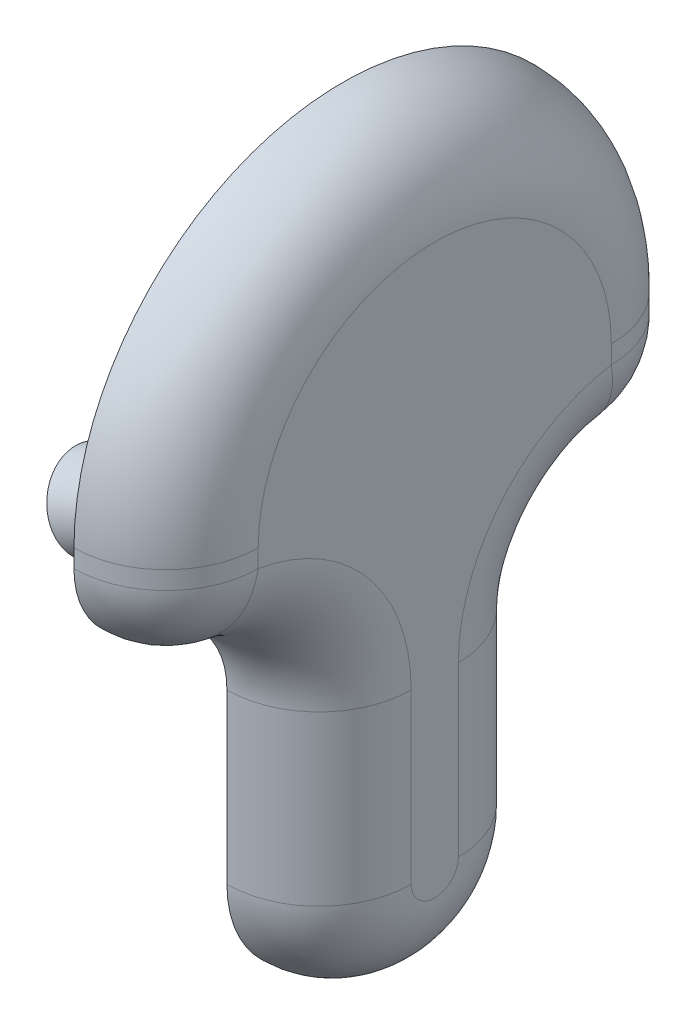
ISO-10303-21;
HEADER;
FILE_DESCRIPTION(('STEP AP214'),'2;1');
FILE_NAME('part.step','',(''),(''),'','','');
FILE_SCHEMA(('AUTOMOTIVE_DESIGN { 1 0 10303 214 1 1 1 1 }'));
ENDSEC;
DATA;
#1=APPLICATION_CONTEXT('core data for automotive mechanical design processes');
#2=APPLICATION_PROTOCOL_DEFINITION('international standard','automotive_design',2000,#1);
#3=PRODUCT_CONTEXT('',#1,'mechanical');
#4=PRODUCT('Part','Part','',(#3));
#5=PRODUCT_RELATED_PRODUCT_CATEGORY('part','',(#4));
#6=PRODUCT_DEFINITION_FORMATION('','',#4);
#7=PRODUCT_DEFINITION_CONTEXT('part definition',#1,'design');
#8=PRODUCT_DEFINITION('design','',#6,#7);
#9=PRODUCT_DEFINITION_SHAPE('','',#8);
#10=(LENGTH_UNIT() NAMED_UNIT(*) SI_UNIT(.MILLI.,.METRE.));
#11=(NAMED_UNIT(*) PLANE_ANGLE_UNIT() SI_UNIT($,.RADIAN.));
#12=(NAMED_UNIT(*) SI_UNIT($,.STERADIAN.) SOLID_ANGLE_UNIT());
#13=UNCERTAINTY_MEASURE_WITH_UNIT(LENGTH_MEASURE(1.E-05),#10,'distance_accuracy_value','');
#14=(GEOMETRIC_REPRESENTATION_CONTEXT(3) GLOBAL_UNCERTAINTY_ASSIGNED_CONTEXT((#13)) GLOBAL_UNIT_ASSIGNED_CONTEXT((#10,
#11,#12)) REPRESENTATION_CONTEXT('',''));
#15=CARTESIAN_POINT('',(0.,0.,0.));
#16=DIRECTION('',(0.,0.,1.));
#17=DIRECTION('',(1.,0.,0.));
#18=AXIS2_PLACEMENT_3D('',#15,#16,#17);
#19=CARTESIAN_POINT('',(0.,0.,57.5));
#20=DIRECTION('',(0.,1.,0.));
#21=DIRECTION('',(0.,0.,1.));
#22=AXIS2_PLACEMENT_3D('',#19,#20,#21);
#23=CYLINDRICAL_SURFACE('',#22,30.);
#24=CARTESIAN_POINT('',(0.,29.1295933013957,57.5));
#25=DIRECTION('',(0.,-1.,0.));
#26=DIRECTION('',(0.,0.,-1.));
#27=AXIS2_PLACEMENT_3D('',#24,#25,#26);
#28=CIRCLE('',#27,30.);
#29=CARTESIAN_POINT('',(30.,29.1295933013957,57.5));
#30=VERTEX_POINT('',#29);
#31=CARTESIAN_POINT('',(0.,29.1295933013957,87.5));
#32=VERTEX_POINT('',#31);
#33=EDGE_CURVE('E11',#30,#32,#28,.T.);
#34=ORIENTED_EDGE('',*,*,#33,.F.);
#35=DIRECTION('',(0.,-1.,0.));
#36=VECTOR('',#35,1.);
#37=CARTESIAN_POINT('',(30.,0.,57.5));
#38=LINE('',#37,#36);
#39=CARTESIAN_POINT('',(30.,35.,57.5));
#40=VERTEX_POINT('',#39);
#41=EDGE_CURVE('E216',#40,#30,#38,.T.);
#42=ORIENTED_EDGE('',*,*,#41,.F.);
#43=CARTESIAN_POINT('',(0.,35.,57.5));
#44=DIRECTION('',(0.,-1.,0.));
#45=DIRECTION('',(0.,0.,-1.));
#46=AXIS2_PLACEMENT_3D('',#43,#44,#45);
#47=CIRCLE('',#46,30.);
#48=CARTESIAN_POINT('',(0.,35.,87.5));
#49=VERTEX_POINT('',#48);
#50=EDGE_CURVE('E53',#40,#49,#47,.T.);
#51=ORIENTED_EDGE('',*,*,#50,.T.);
#52=DIRECTION('',(0.,-1.,0.));
#53=VECTOR('',#52,1.);
#54=CARTESIAN_POINT('',(0.,122.5,87.5));
#55=LINE('',#54,#53);
#56=EDGE_CURVE('E148',#49,#32,#55,.T.);
#57=ORIENTED_EDGE('',*,*,#56,.T.);
#58=EDGE_LOOP('',(#34,#42,#51,#57));
#59=FACE_BOUND('',#58,.T.);
#60=ADVANCED_FACE('F44',(#59),#23,.T.);
#61=CARTESIAN_POINT('',(0.,35.,0.));
#62=DIRECTION('',(1.,0.,0.));
#63=DIRECTION('',(0.,0.,-1.));
#64=AXIS2_PLACEMENT_3D('',#61,#62,#63);
#65=TOROIDAL_SURFACE('',#64,57.5,30.);
#66=ORIENTED_EDGE('',*,*,#50,.F.);
#67=CARTESIAN_POINT('',(30.,35.,0.));
#68=DIRECTION('',(1.,0.,0.));
#69=DIRECTION('',(0.,0.,-1.));
#70=AXIS2_PLACEMENT_3D('',#67,#68,#69);
#71=CIRCLE('',#70,57.5);
#72=CARTESIAN_POINT('',(30.,35.,-57.5));
#73=VERTEX_POINT('',#72);
#74=EDGE_CURVE('E220',#73,#40,#71,.T.);
#75=ORIENTED_EDGE('',*,*,#74,.F.);
#76=CARTESIAN_POINT('',(0.,35.,-57.5));
#77=DIRECTION('',(0.,1.,0.));
#78=DIRECTION('',(0.,0.,1.));
#79=AXIS2_PLACEMENT_3D('',#76,#77,#78);
#80=CIRCLE('',#79,30.);
#81=CARTESIAN_POINT('',(0.,35.,-87.5));
#82=VERTEX_POINT('',#81);
#83=EDGE_CURVE('E60',#73,#82,#80,.T.);
#84=ORIENTED_EDGE('',*,*,#83,.T.);
#85=CARTESIAN_POINT('',(0.,35.,0.));
#86=DIRECTION('',(1.,0.,0.));
#87=DIRECTION('',(0.,0.,-1.));
#88=AXIS2_PLACEMENT_3D('',#85,#86,#87);
#89=CIRCLE('',#88,87.5);
#90=EDGE_CURVE('E168',#49,#82,#89,.F.);
#91=ORIENTED_EDGE('',*,*,#90,.F.);
#92=EDGE_LOOP('',(#66,#75,#84,#91));
#93=FACE_BOUND('',#92,.T.);
#94=ADVANCED_FACE('F237',(#93),#65,.T.);
#95=CARTESIAN_POINT('',(0.,0.,-57.5));
#96=DIRECTION('',(0.,-1.,0.));
#97=DIRECTION('',(0.,0.,-1.));
#98=AXIS2_PLACEMENT_3D('',#95,#96,#97);
#99=CYLINDRICAL_SURFACE('',#98,30.);
#100=ORIENTED_EDGE('',*,*,#83,.F.);
#101=DIRECTION('',(0.,1.,0.));
#102=VECTOR('',#101,1.);
#103=CARTESIAN_POINT('',(30.,0.,-57.5));
#104=LINE('',#103,#102);
#105=CARTESIAN_POINT('',(30.,29.1295933013957,-57.5));
#106=VERTEX_POINT('',#105);
#107=EDGE_CURVE('E223',#106,#73,#104,.T.);
#108=ORIENTED_EDGE('',*,*,#107,.F.);
#109=CARTESIAN_POINT('',(0.,29.1295933013957,-57.5));
#110=DIRECTION('',(0.,1.,0.));
#111=DIRECTION('',(0.,0.,1.));
#112=AXIS2_PLACEMENT_3D('',#109,#110,#111);
#113=CIRCLE('',#112,30.);
#114=CARTESIAN_POINT('',(0.,29.1295933013957,-87.5));
#115=VERTEX_POINT('',#114);
#116=EDGE_CURVE('E229',#106,#115,#113,.T.);
#117=ORIENTED_EDGE('',*,*,#116,.T.);
#118=DIRECTION('',(0.,1.,0.));
#119=VECTOR('',#118,1.);
#120=CARTESIAN_POINT('',(0.,122.5,-87.5));
#121=LINE('',#120,#119);
#122=EDGE_CURVE('E143',#115,#82,#121,.T.);
#123=ORIENTED_EDGE('',*,*,#122,.T.);
#124=EDGE_LOOP('',(#100,#108,#117,#123));
#125=FACE_BOUND('',#124,.T.);
#126=ADVANCED_FACE('F270',(#125),#99,.T.);
#127=CARTESIAN_POINT('',(0.,29.1295933013957,-57.5));
#128=DIRECTION('',(0.,0.,1.));
#129=DIRECTION('',(0.,-1.,0.));
#130=AXIS2_PLACEMENT_3D('',#127,#128,#129);
#131=SPHERICAL_SURFACE('',#130,30.);
#132=ORIENTED_EDGE('',*,*,#116,.F.);
#133=CARTESIAN_POINT('',(0.,29.1295933013957,-57.5));
#134=DIRECTION('',(0.,-0.169714790172235,0.985493221689928));
#135=DIRECTION('',(0.,-0.985493221689928,-0.169714790172235));
#136=AXIS2_PLACEMENT_3D('',#133,#134,#135);
#137=CIRCLE('',#136,30.);
#138=CARTESIAN_POINT('',(0.,-0.435203349302138,-62.5914437051671));
#139=VERTEX_POINT('',#138);
#140=EDGE_CURVE('E205',#139,#106,#137,.T.);
#141=ORIENTED_EDGE('',*,*,#140,.F.);
#142=CARTESIAN_POINT('',(0.,29.1295933013957,-57.5));
#143=DIRECTION('',(1.,0.,0.));
#144=DIRECTION('',(0.,0.,-1.));
#145=AXIS2_PLACEMENT_3D('',#142,#143,#144);
#146=CIRCLE('',#145,30.);
#147=EDGE_CURVE('E213',#115,#139,#146,.F.);
#148=ORIENTED_EDGE('',*,*,#147,.F.);
#149=EDGE_LOOP('',(#132,#141,#148));
#150=FACE_BOUND('',#149,.T.);
#151=ADVANCED_FACE('F269',(#150),#131,.T.);
#152=CARTESIAN_POINT('',(0.,29.1295933013957,57.5));
#153=DIRECTION('',(0.,0.,-1.));
#154=DIRECTION('',(0.,1.,0.));
#155=AXIS2_PLACEMENT_3D('',#152,#153,#154);
#156=SPHERICAL_SURFACE('',#155,30.);
#157=CARTESIAN_POINT('',(0.,29.1295933013957,57.5));
#158=DIRECTION('',(0.,0.169714790172235,0.985493221689928));
#159=DIRECTION('',(0.,-0.985493221689928,0.169714790172235));
#160=AXIS2_PLACEMENT_3D('',#157,#158,#159);
#161=CIRCLE('',#160,30.);
#162=CARTESIAN_POINT('',(0.,-0.435203349302141,62.591443705167));
#163=VERTEX_POINT('',#162);
#164=EDGE_CURVE('E226',#30,#163,#161,.F.);
#165=ORIENTED_EDGE('',*,*,#164,.F.);
#166=ORIENTED_EDGE('',*,*,#33,.T.);
#167=CARTESIAN_POINT('',(0.,29.1295933013957,57.5));
#168=DIRECTION('',(1.,0.,0.));
#169=DIRECTION('',(0.,0.,-1.));
#170=AXIS2_PLACEMENT_3D('',#167,#168,#169);
#171=CIRCLE('',#170,30.);
#172=EDGE_CURVE('E209',#163,#32,#171,.F.);
#173=ORIENTED_EDGE('',*,*,#172,.F.);
#174=EDGE_LOOP('',(#165,#166,#173));
#175=FACE_BOUND('',#174,.T.);
#176=ADVANCED_FACE('F46',(#175),#156,.T.);
#177=CARTESIAN_POINT('',(0.,-30.,-67.6828874103341));
#178=DIRECTION('',(1.,0.,0.));
#179=DIRECTION('',(0.,0.,-1.));
#180=AXIS2_PLACEMENT_3D('',#177,#178,#179);
#181=TOROIDAL_SURFACE('',#180,60.,30.);
#182=CARTESIAN_POINT('',(0.,-30.,-67.6828874103341));
#183=DIRECTION('',(1.,0.,0.));
#184=DIRECTION('',(0.,0.,-1.));
#185=AXIS2_PLACEMENT_3D('',#182,#183,#184);
#186=CIRCLE('',#185,30.);
#187=CARTESIAN_POINT('',(0.,-30.,-37.6828874103342));
#188=VERTEX_POINT('',#187);
#189=EDGE_CURVE('E164',#188,#139,#186,.F.);
#190=ORIENTED_EDGE('',*,*,#189,.T.);
#191=ORIENTED_EDGE('',*,*,#140,.T.);
#192=CARTESIAN_POINT('',(30.,-30.,-67.6828874103341));
#193=DIRECTION('',(1.,0.,0.));
#194=DIRECTION('',(0.,0.,-1.));
#195=AXIS2_PLACEMENT_3D('',#192,#193,#194);
#196=CIRCLE('',#195,60.);
#197=CARTESIAN_POINT('',(30.,-30.,-7.68288741033416));
#198=VERTEX_POINT('',#197);
#199=EDGE_CURVE('E129',#198,#106,#196,.F.);
#200=ORIENTED_EDGE('',*,*,#199,.F.);
#201=CARTESIAN_POINT('',(0.,-30.,-7.68288741033416));
#202=DIRECTION('',(0.,1.,0.));
#203=DIRECTION('',(0.,0.,1.));
#204=AXIS2_PLACEMENT_3D('',#201,#202,#203);
#205=CIRCLE('',#204,30.);
#206=EDGE_CURVE('E202',#198,#188,#205,.T.);
#207=ORIENTED_EDGE('',*,*,#206,.T.);
#208=EDGE_LOOP('',(#190,#191,#200,#207));
#209=FACE_BOUND('',#208,.T.);
#210=ADVANCED_FACE('F264',(#209),#181,.T.);
#211=CARTESIAN_POINT('',(0.,0.,-7.68288741033416));
#212=DIRECTION('',(0.,-1.,0.));
#213=DIRECTION('',(0.,0.,-1.));
#214=AXIS2_PLACEMENT_3D('',#211,#212,#213);
#215=CYLINDRICAL_SURFACE('',#214,30.);
#216=ORIENTED_EDGE('',*,*,#206,.F.);
#217=DIRECTION('',(0.,1.,0.));
#218=VECTOR('',#217,1.);
#219=CARTESIAN_POINT('',(30.,0.,-7.68288741033416));
#220=LINE('',#219,#218);
#221=CARTESIAN_POINT('',(30.,-84.8171125896658,-7.68288741033416));
#222=VERTEX_POINT('',#221);
#223=EDGE_CURVE('E177',#222,#198,#220,.T.);
#224=ORIENTED_EDGE('',*,*,#223,.F.);
#225=CARTESIAN_POINT('',(0.,-84.8171125896658,-7.68288741033416));
#226=DIRECTION('',(0.,1.,0.));
#227=DIRECTION('',(0.,0.,1.));
#228=AXIS2_PLACEMENT_3D('',#225,#226,#227);
#229=CIRCLE('',#228,30.);
#230=CARTESIAN_POINT('',(0.,-84.8171125896658,-37.6828874103342));
#231=VERTEX_POINT('',#230);
#232=EDGE_CURVE('E199',#222,#231,#229,.T.);
#233=ORIENTED_EDGE('',*,*,#232,.T.);
#234=DIRECTION('',(0.,1.,0.));
#235=VECTOR('',#234,1.);
#236=CARTESIAN_POINT('',(0.,-122.5,-37.6828874103342));
#237=LINE('',#236,#235);
#238=EDGE_CURVE('E156',#231,#188,#237,.T.);
#239=ORIENTED_EDGE('',*,*,#238,.T.);
#240=EDGE_LOOP('',(#216,#224,#233,#239));
#241=FACE_BOUND('',#240,.T.);
#242=ADVANCED_FACE('F261',(#241),#215,.T.);
#243=CARTESIAN_POINT('',(0.,-84.8171125896658,0.));
#244=DIRECTION('',(1.,0.,0.));
#245=DIRECTION('',(0.,0.,-1.));
#246=AXIS2_PLACEMENT_3D('',#243,#244,#245);
#247=DEGENERATE_TOROIDAL_SURFACE('',#246,7.68288741033413,30.,.T.);
#248=ORIENTED_EDGE('',*,*,#232,.F.);
#249=CARTESIAN_POINT('',(30.,-84.8171125896658,0.));
#250=DIRECTION('',(1.,0.,0.));
#251=DIRECTION('',(0.,0.,-1.));
#252=AXIS2_PLACEMENT_3D('',#249,#250,#251);
#253=CIRCLE('',#252,7.68288741033413);
#254=CARTESIAN_POINT('',(30.,-84.8171125896658,7.6828874103341));
#255=VERTEX_POINT('',#254);
#256=EDGE_CURVE('E181',#255,#222,#253,.T.);
#257=ORIENTED_EDGE('',*,*,#256,.F.);
#258=CARTESIAN_POINT('',(0.,-84.8171125896658,7.6828874103341));
#259=DIRECTION('',(0.,-1.,0.));
#260=DIRECTION('',(0.,0.,-1.));
#261=AXIS2_PLACEMENT_3D('',#258,#259,#260);
#262=CIRCLE('',#261,30.);
#263=CARTESIAN_POINT('',(0.,-84.8171125896658,37.6828874103341));
#264=VERTEX_POINT('',#263);
#265=EDGE_CURVE('E196',#255,#264,#262,.T.);
#266=ORIENTED_EDGE('',*,*,#265,.T.);
#267=CARTESIAN_POINT('',(0.,-84.8171125896658,0.));
#268=DIRECTION('',(1.,0.,0.));
#269=DIRECTION('',(0.,0.,-1.));
#270=AXIS2_PLACEMENT_3D('',#267,#268,#269);
#271=CIRCLE('',#270,37.6828874103341);
#272=EDGE_CURVE('E160',#231,#264,#271,.F.);
#273=ORIENTED_EDGE('',*,*,#272,.F.);
#274=EDGE_LOOP('',(#248,#257,#266,#273));
#275=FACE_BOUND('',#274,.T.);
#276=ADVANCED_FACE('F257',(#275),#247,.T.);
#277=CARTESIAN_POINT('',(0.,0.,7.6828874103341));
#278=DIRECTION('',(0.,1.,0.));
#279=DIRECTION('',(0.,0.,1.));
#280=AXIS2_PLACEMENT_3D('',#277,#278,#279);
#281=CYLINDRICAL_SURFACE('',#280,30.);
#282=ORIENTED_EDGE('',*,*,#265,.F.);
#283=DIRECTION('',(0.,-1.,0.));
#284=VECTOR('',#283,1.);
#285=CARTESIAN_POINT('',(30.,0.,7.6828874103341));
#286=LINE('',#285,#284);
#287=CARTESIAN_POINT('',(30.,-30.,7.6828874103341));
#288=VERTEX_POINT('',#287);
#289=EDGE_CURVE('E185',#288,#255,#286,.T.);
#290=ORIENTED_EDGE('',*,*,#289,.F.);
#291=CARTESIAN_POINT('',(0.,-30.,7.6828874103341));
#292=DIRECTION('',(0.,-1.,0.));
#293=DIRECTION('',(0.,0.,-1.));
#294=AXIS2_PLACEMENT_3D('',#291,#292,#293);
#295=CIRCLE('',#294,30.);
#296=CARTESIAN_POINT('',(0.,-30.,37.6828874103341));
#297=VERTEX_POINT('',#296);
#298=EDGE_CURVE('E192',#288,#297,#295,.T.);
#299=ORIENTED_EDGE('',*,*,#298,.T.);
#300=DIRECTION('',(0.,-1.,0.));
#301=VECTOR('',#300,1.);
#302=CARTESIAN_POINT('',(0.,-122.5,37.6828874103341));
#303=LINE('',#302,#301);
#304=EDGE_CURVE('E152',#297,#264,#303,.T.);
#305=ORIENTED_EDGE('',*,*,#304,.T.);
#306=EDGE_LOOP('',(#282,#290,#299,#305));
#307=FACE_BOUND('',#306,.T.);
#308=ADVANCED_FACE('F253',(#307),#281,.T.);
#309=CARTESIAN_POINT('',(0.,-30.,67.6828874103341));
#310=DIRECTION('',(1.,0.,0.));
#311=DIRECTION('',(0.,0.,-1.));
#312=AXIS2_PLACEMENT_3D('',#309,#310,#311);
#313=TOROIDAL_SURFACE('',#312,60.,30.);
#314=CARTESIAN_POINT('',(30.,-30.,67.6828874103341));
#315=DIRECTION('',(1.,0.,0.));
#316=DIRECTION('',(0.,0.,-1.));
#317=AXIS2_PLACEMENT_3D('',#314,#315,#316);
#318=CIRCLE('',#317,60.);
#319=EDGE_CURVE('E189',#30,#288,#318,.F.);
#320=ORIENTED_EDGE('',*,*,#319,.F.);
#321=ORIENTED_EDGE('',*,*,#164,.T.);
#322=CARTESIAN_POINT('',(0.,-30.,67.6828874103341));
#323=DIRECTION('',(1.,0.,0.));
#324=DIRECTION('',(0.,0.,-1.));
#325=AXIS2_PLACEMENT_3D('',#322,#323,#324);
#326=CIRCLE('',#325,30.);
#327=EDGE_CURVE('E135',#163,#297,#326,.F.);
#328=ORIENTED_EDGE('',*,*,#327,.T.);
#329=ORIENTED_EDGE('',*,*,#298,.F.);
#330=EDGE_LOOP('',(#320,#321,#328,#329));
#331=FACE_BOUND('',#330,.T.);
#332=ADVANCED_FACE('F250',(#331),#313,.T.);
#333=CARTESIAN_POINT('',(0.,0.,0.));
#334=DIRECTION('',(1.,0.,0.));
#335=DIRECTION('',(0.,0.,-1.));
#336=AXIS2_PLACEMENT_3D('',#333,#334,#335);
#337=PLANE('',#336);
#338=ORIENTED_EDGE('',*,*,#122,.F.);
#339=ORIENTED_EDGE('',*,*,#147,.T.);
#340=ORIENTED_EDGE('',*,*,#189,.F.);
#341=ORIENTED_EDGE('',*,*,#238,.F.);
#342=ORIENTED_EDGE('',*,*,#272,.T.);
#343=ORIENTED_EDGE('',*,*,#304,.F.);
#344=ORIENTED_EDGE('',*,*,#327,.F.);
#345=ORIENTED_EDGE('',*,*,#172,.T.);
#346=ORIENTED_EDGE('',*,*,#56,.F.);
#347=ORIENTED_EDGE('',*,*,#90,.T.);
#348=EDGE_LOOP('',(#338,#339,#340,#341,#342,#343,#344,#345,#346,#347));
#349=FACE_BOUND('',#348,.T.);
#350=CARTESIAN_POINT('',(0.,0.,0.));
#351=DIRECTION('',(1.,0.,0.));
#352=DIRECTION('',(0.,1.,0.));
#353=AXIS2_PLACEMENT_3D('',#350,#351,#352);
#354=ELLIPSE('',#353,15.3249078990846,14.);
#355=CARTESIAN_POINT('',(0.,0.,-14.));
#356=VERTEX_POINT('',#355);
#357=CARTESIAN_POINT('',(0.,0.,14.));
#358=VERTEX_POINT('',#357);
#359=EDGE_CURVE('E121',#356,#358,#354,.F.);
#360=ORIENTED_EDGE('',*,*,#359,.F.);
#361=DIRECTION('',(0.,0.,-1.));
#362=VECTOR('',#361,1.);
#363=CARTESIAN_POINT('',(0.,0.,0.));
#364=LINE('',#363,#362);
#365=EDGE_CURVE('E124',#358,#356,#364,.T.);
#366=ORIENTED_EDGE('',*,*,#365,.F.);
#367=EDGE_LOOP('',(#360,#366));
#368=FACE_BOUND('',#367,.T.);
#369=ADVANCED_FACE('F123',(#349,#368),#337,.F.);
#370=CARTESIAN_POINT('',(-81.2396715032777,-36.1702321383015,0.));
#371=DIRECTION('',(0.913545457642602,0.406736643075798,0.));
#372=DIRECTION('',(-0.406736643075798,0.913545457642602,0.));
#373=AXIS2_PLACEMENT_3D('',#370,#371,#372);
#374=CYLINDRICAL_SURFACE('',#373,14.);
#375=CARTESIAN_POINT('',(-81.2396715032777,-36.1702321383015,0.));
#376=DIRECTION('',(-0.913545457642602,-0.406736643075798,0.));
#377=DIRECTION('',(0.406736643075798,-0.913545457642602,0.));
#378=AXIS2_PLACEMENT_3D('',#375,#376,#377);
#379=CIRCLE('',#378,14.);
#380=CARTESIAN_POINT('',(-75.5453585002165,-48.9598685452979,0.));
#381=VERTEX_POINT('',#380);
#382=EDGE_CURVE('E139',#381,#381,#379,.T.);
#383=ORIENTED_EDGE('',*,*,#382,.F.);
#384=EDGE_LOOP('',(#383));
#385=FACE_BOUND('',#384,.T.);
#386=CARTESIAN_POINT('',(0.,0.,0.));
#387=DIRECTION('',(-0.913545457642602,-0.406736643075798,0.));
#388=DIRECTION('',(0.406736643075798,-0.913545457642602,0.));
#389=AXIS2_PLACEMENT_3D('',#386,#387,#388);
#390=CIRCLE('',#389,14.);
#391=EDGE_CURVE('E133',#358,#356,#390,.T.);
#392=ORIENTED_EDGE('',*,*,#391,.T.);
#393=ORIENTED_EDGE('',*,*,#359,.T.);
#394=EDGE_LOOP('',(#392,#393));
#395=FACE_BOUND('',#394,.T.);
#396=ADVANCED_FACE('F137',(#385,#395),#374,.T.);
#397=CARTESIAN_POINT('',(0.,0.,0.));
#398=DIRECTION('',(-0.913545457642602,-0.406736643075798,0.));
#399=DIRECTION('',(0.406736643075798,-0.913545457642602,0.));
#400=AXIS2_PLACEMENT_3D('',#397,#398,#399);
#401=PLANE('',#400);
#402=ORIENTED_EDGE('',*,*,#391,.F.);
#403=ORIENTED_EDGE('',*,*,#365,.T.);
#404=EDGE_LOOP('',(#402,#403));
#405=FACE_BOUND('',#404,.T.);
#406=ADVANCED_FACE('F132',(#405),#401,.F.);
#407=CARTESIAN_POINT('',(-81.2396715032777,-36.1702321383015,0.));
#408=DIRECTION('',(-0.913545457642602,-0.406736643075798,0.));
#409=DIRECTION('',(0.406736643075798,-0.913545457642602,0.));
#410=AXIS2_PLACEMENT_3D('',#407,#408,#409);
#411=PLANE('',#410);
#412=ORIENTED_EDGE('',*,*,#382,.T.);
#413=EDGE_LOOP('',(#412));
#414=FACE_BOUND('',#413,.T.);
#415=ADVANCED_FACE('F287',(#414),#411,.T.);
#416=CARTESIAN_POINT('',(30.,0.,0.));
#417=DIRECTION('',(1.,0.,0.));
#418=DIRECTION('',(0.,0.,-1.));
#419=AXIS2_PLACEMENT_3D('',#416,#417,#418);
#420=PLANE('',#419);
#421=ORIENTED_EDGE('',*,*,#199,.T.);
#422=ORIENTED_EDGE('',*,*,#107,.T.);
#423=ORIENTED_EDGE('',*,*,#74,.T.);
#424=ORIENTED_EDGE('',*,*,#41,.T.);
#425=ORIENTED_EDGE('',*,*,#319,.T.);
#426=ORIENTED_EDGE('',*,*,#289,.T.);
#427=ORIENTED_EDGE('',*,*,#256,.T.);
#428=ORIENTED_EDGE('',*,*,#223,.T.);
#429=EDGE_LOOP('',(#421,#422,#423,#424,#425,#426,#427,#428));
#430=FACE_BOUND('',#429,.T.);
#431=ADVANCED_FACE('F248',(#430),#420,.T.);
#432=CLOSED_SHELL('',(#60,#94,#126,#151,#176,#210,#242,#276,#308,#332,#369,#396,#406,#415,#431));
#433=MANIFOLD_SOLID_BREP('B2',#432);
#434=ADVANCED_BREP_SHAPE_REPRESENTATION('',(#18,#433),#14);
#435=SHAPE_DEFINITION_REPRESENTATION(#9,#434);
ENDSEC;
END-ISO-10303-21;
